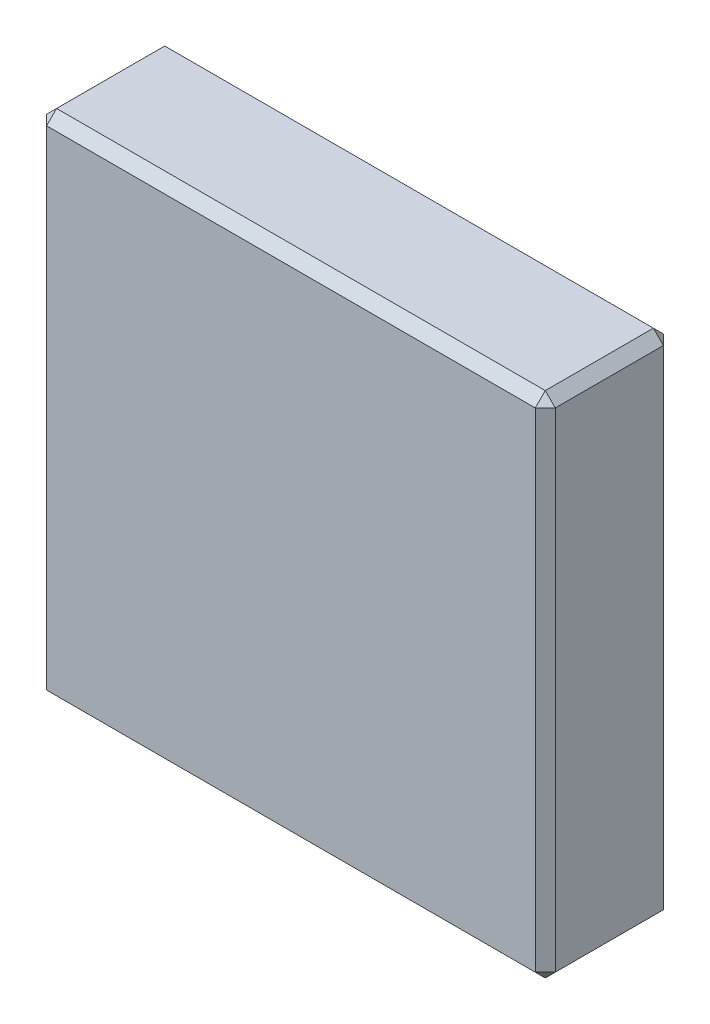
ISO-10303-21;
HEADER;
FILE_DESCRIPTION(('STEP AP214'),'2;1');
FILE_NAME('part.step','',(''),(''),'','','');
FILE_SCHEMA(('AUTOMOTIVE_DESIGN { 1 0 10303 214 1 1 1 1 }'));
ENDSEC;
DATA;
#1=APPLICATION_CONTEXT('core data for automotive mechanical design processes');
#2=APPLICATION_PROTOCOL_DEFINITION('international standard','automotive_design',2000,#1);
#3=PRODUCT_CONTEXT('',#1,'mechanical');
#4=PRODUCT('Part','Part','',(#3));
#5=PRODUCT_RELATED_PRODUCT_CATEGORY('part','',(#4));
#6=PRODUCT_DEFINITION_FORMATION('','',#4);
#7=PRODUCT_DEFINITION_CONTEXT('part definition',#1,'design');
#8=PRODUCT_DEFINITION('design','',#6,#7);
#9=PRODUCT_DEFINITION_SHAPE('','',#8);
#10=(LENGTH_UNIT() NAMED_UNIT(*) SI_UNIT(.MILLI.,.METRE.));
#11=(NAMED_UNIT(*) PLANE_ANGLE_UNIT() SI_UNIT($,.RADIAN.));
#12=(NAMED_UNIT(*) SI_UNIT($,.STERADIAN.) SOLID_ANGLE_UNIT());
#13=UNCERTAINTY_MEASURE_WITH_UNIT(LENGTH_MEASURE(1.E-05),#10,'distance_accuracy_value','');
#14=(GEOMETRIC_REPRESENTATION_CONTEXT(3) GLOBAL_UNCERTAINTY_ASSIGNED_CONTEXT((#13)) GLOBAL_UNIT_ASSIGNED_CONTEXT((#10,
#11,#12)) REPRESENTATION_CONTEXT('',''));
#15=CARTESIAN_POINT('',(0.,0.,0.));
#16=DIRECTION('',(0.,0.,1.));
#17=DIRECTION('',(1.,0.,0.));
#18=AXIS2_PLACEMENT_3D('',#15,#16,#17);
#19=CARTESIAN_POINT('',(-36.1080001619622,-4.88512596132532,16.3076773065464));
#20=DIRECTION('',(1.,0.,0.));
#21=DIRECTION('',(0.,0.,-1.));
#22=AXIS2_PLACEMENT_3D('',#19,#20,#21);
#23=PLANE('',#22);
#24=DIRECTION('',(0.,0.,-1.));
#25=VECTOR('',#24,1.);
#26=CARTESIAN_POINT('',(-36.1080001619622,7.56487403867468,16.3076773065464));
#27=LINE('',#26,#25);
#28=CARTESIAN_POINT('',(-36.1080001619622,7.56487403867468,16.0576773065464));
#29=VERTEX_POINT('',#28);
#30=CARTESIAN_POINT('',(-36.1080001619622,7.56487403867468,13.3576773065464));
#31=VERTEX_POINT('',#30);
#32=EDGE_CURVE('E113',#29,#31,#27,.T.);
#33=ORIENTED_EDGE('',*,*,#32,.T.);
#34=DIRECTION('',(0.,-1.,0.));
#35=VECTOR('',#34,1.);
#36=CARTESIAN_POINT('',(-36.1080001619622,-4.88512596132532,13.3576773065464));
#37=LINE('',#36,#35);
#38=CARTESIAN_POINT('',(-36.1080001619622,-4.63512596132532,13.3576773065464));
#39=VERTEX_POINT('',#38);
#40=EDGE_CURVE('E109',#31,#39,#37,.T.);
#41=ORIENTED_EDGE('',*,*,#40,.T.);
#42=DIRECTION('',(0.,0.,1.));
#43=VECTOR('',#42,1.);
#44=CARTESIAN_POINT('',(-36.1080001619622,-4.63512596132532,16.3076773065464));
#45=LINE('',#44,#43);
#46=CARTESIAN_POINT('',(-36.1080001619622,-4.63512596132532,16.0576773065464));
#47=VERTEX_POINT('',#46);
#48=EDGE_CURVE('E104',#39,#47,#45,.T.);
#49=ORIENTED_EDGE('',*,*,#48,.T.);
#50=DIRECTION('',(0.,1.,0.));
#51=VECTOR('',#50,1.);
#52=CARTESIAN_POINT('',(-36.1080001619622,-4.88512596132532,16.0576773065464));
#53=LINE('',#52,#51);
#54=EDGE_CURVE('E106',#47,#29,#53,.T.);
#55=ORIENTED_EDGE('',*,*,#54,.T.);
#56=EDGE_LOOP('',(#33,#41,#49,#55));
#57=FACE_BOUND('',#56,.T.);
#58=ADVANCED_FACE('F16',(#57),#23,.F.);
#59=CARTESIAN_POINT('',(-36.1080001619622,-4.88512596132532,16.3076773065464));
#60=DIRECTION('',(0.,1.,0.));
#61=DIRECTION('',(0.,0.,1.));
#62=AXIS2_PLACEMENT_3D('',#59,#60,#61);
#63=PLANE('',#62);
#64=DIRECTION('',(1.,0.,0.));
#65=VECTOR('',#64,1.);
#66=CARTESIAN_POINT('',(-23.4080001619622,-4.88512596132532,13.3576773065464));
#67=LINE('',#66,#65);
#68=CARTESIAN_POINT('',(-35.8580001619622,-4.88512596132532,13.3576773065464));
#69=VERTEX_POINT('',#68);
#70=CARTESIAN_POINT('',(-23.6580001619622,-4.88512596132532,13.3576773065464));
#71=VERTEX_POINT('',#70);
#72=EDGE_CURVE('E264',#69,#71,#67,.T.);
#73=ORIENTED_EDGE('',*,*,#72,.T.);
#74=DIRECTION('',(0.,0.,1.));
#75=VECTOR('',#74,1.);
#76=CARTESIAN_POINT('',(-23.6580001619622,-4.88512596132532,16.3076773065464));
#77=LINE('',#76,#75);
#78=CARTESIAN_POINT('',(-23.6580001619622,-4.88512596132532,16.0576773065464));
#79=VERTEX_POINT('',#78);
#80=EDGE_CURVE('E203',#71,#79,#77,.T.);
#81=ORIENTED_EDGE('',*,*,#80,.T.);
#82=DIRECTION('',(-1.,0.,0.));
#83=VECTOR('',#82,1.);
#84=CARTESIAN_POINT('',(-36.1080001619622,-4.88512596132532,16.0576773065464));
#85=LINE('',#84,#83);
#86=CARTESIAN_POINT('',(-35.8580001619622,-4.88512596132532,16.0576773065464));
#87=VERTEX_POINT('',#86);
#88=EDGE_CURVE('E261',#79,#87,#85,.T.);
#89=ORIENTED_EDGE('',*,*,#88,.T.);
#90=DIRECTION('',(0.,0.,-1.));
#91=VECTOR('',#90,1.);
#92=CARTESIAN_POINT('',(-35.8580001619622,-4.88512596132532,16.3076773065464));
#93=LINE('',#92,#91);
#94=EDGE_CURVE('E134',#87,#69,#93,.T.);
#95=ORIENTED_EDGE('',*,*,#94,.T.);
#96=EDGE_LOOP('',(#73,#81,#89,#95));
#97=FACE_BOUND('',#96,.T.);
#98=ADVANCED_FACE('F268',(#97),#63,.F.);
#99=CARTESIAN_POINT('',(-23.4080001619622,-4.88512596132532,16.3076773065464));
#100=DIRECTION('',(-1.,0.,0.));
#101=DIRECTION('',(0.,0.,1.));
#102=AXIS2_PLACEMENT_3D('',#99,#100,#101);
#103=PLANE('',#102);
#104=DIRECTION('',(0.,-1.,0.));
#105=VECTOR('',#104,1.);
#106=CARTESIAN_POINT('',(-23.4080001619622,-4.88512596132532,16.0576773065464));
#107=LINE('',#106,#105);
#108=CARTESIAN_POINT('',(-23.4080001619622,7.56487403867468,16.0576773065464));
#109=VERTEX_POINT('',#108);
#110=CARTESIAN_POINT('',(-23.4080001619622,-4.63512596132532,16.0576773065464));
#111=VERTEX_POINT('',#110);
#112=EDGE_CURVE('E249',#109,#111,#107,.T.);
#113=ORIENTED_EDGE('',*,*,#112,.T.);
#114=DIRECTION('',(0.,0.,-1.));
#115=VECTOR('',#114,1.);
#116=CARTESIAN_POINT('',(-23.4080001619622,-4.63512596132532,16.3076773065464));
#117=LINE('',#116,#115);
#118=CARTESIAN_POINT('',(-23.4080001619622,-4.63512596132532,13.3576773065464));
#119=VERTEX_POINT('',#118);
#120=EDGE_CURVE('E258',#111,#119,#117,.T.);
#121=ORIENTED_EDGE('',*,*,#120,.T.);
#122=DIRECTION('',(0.,1.,0.));
#123=VECTOR('',#122,1.);
#124=CARTESIAN_POINT('',(-23.4080001619622,7.81487403867468,13.3576773065464));
#125=LINE('',#124,#123);
#126=CARTESIAN_POINT('',(-23.4080001619622,7.56487403867468,13.3576773065464));
#127=VERTEX_POINT('',#126);
#128=EDGE_CURVE('E256',#119,#127,#125,.T.);
#129=ORIENTED_EDGE('',*,*,#128,.T.);
#130=DIRECTION('',(0.,0.,1.));
#131=VECTOR('',#130,1.);
#132=CARTESIAN_POINT('',(-23.4080001619622,7.56487403867468,16.3076773065464));
#133=LINE('',#132,#131);
#134=EDGE_CURVE('E193',#127,#109,#133,.T.);
#135=ORIENTED_EDGE('',*,*,#134,.T.);
#136=EDGE_LOOP('',(#113,#121,#129,#135));
#137=FACE_BOUND('',#136,.T.);
#138=ADVANCED_FACE('F289',(#137),#103,.F.);
#139=CARTESIAN_POINT('',(-36.1080001619622,7.81487403867468,16.3076773065464));
#140=DIRECTION('',(0.,-1.,0.));
#141=DIRECTION('',(0.,0.,-1.));
#142=AXIS2_PLACEMENT_3D('',#139,#140,#141);
#143=PLANE('',#142);
#144=DIRECTION('',(-1.,0.,0.));
#145=VECTOR('',#144,1.);
#146=CARTESIAN_POINT('',(-36.1080001619622,7.81487403867468,13.3576773065464));
#147=LINE('',#146,#145);
#148=CARTESIAN_POINT('',(-23.6580001619622,7.81487403867468,13.3576773065464));
#149=VERTEX_POINT('',#148);
#150=CARTESIAN_POINT('',(-35.8580001619622,7.81487403867468,13.3576773065464));
#151=VERTEX_POINT('',#150);
#152=EDGE_CURVE('E198',#149,#151,#147,.T.);
#153=ORIENTED_EDGE('',*,*,#152,.T.);
#154=DIRECTION('',(0.,0.,1.));
#155=VECTOR('',#154,1.);
#156=CARTESIAN_POINT('',(-35.8580001619622,7.81487403867468,16.3076773065464));
#157=LINE('',#156,#155);
#158=CARTESIAN_POINT('',(-35.8580001619622,7.81487403867468,16.0576773065464));
#159=VERTEX_POINT('',#158);
#160=EDGE_CURVE('E201',#151,#159,#157,.T.);
#161=ORIENTED_EDGE('',*,*,#160,.T.);
#162=DIRECTION('',(1.,0.,0.));
#163=VECTOR('',#162,1.);
#164=CARTESIAN_POINT('',(-36.1080001619622,7.81487403867468,16.0576773065464));
#165=LINE('',#164,#163);
#166=CARTESIAN_POINT('',(-23.6580001619622,7.81487403867468,16.0576773065464));
#167=VERTEX_POINT('',#166);
#168=EDGE_CURVE('E199',#159,#167,#165,.T.);
#169=ORIENTED_EDGE('',*,*,#168,.T.);
#170=DIRECTION('',(0.,0.,-1.));
#171=VECTOR('',#170,1.);
#172=CARTESIAN_POINT('',(-23.6580001619622,7.81487403867468,16.3076773065464));
#173=LINE('',#172,#171);
#174=EDGE_CURVE('E195',#167,#149,#173,.T.);
#175=ORIENTED_EDGE('',*,*,#174,.T.);
#176=EDGE_LOOP('',(#153,#161,#169,#175));
#177=FACE_BOUND('',#176,.T.);
#178=ADVANCED_FACE('F482',(#177),#143,.F.);
#179=CARTESIAN_POINT('',(-36.1080001619622,7.81487403867468,16.3076773065464));
#180=DIRECTION('',(0.,0.,-1.));
#181=DIRECTION('',(-1.,0.,0.));
#182=AXIS2_PLACEMENT_3D('',#179,#180,#181);
#183=PLANE('',#182);
#184=DIRECTION('',(1.,0.,0.));
#185=VECTOR('',#184,1.);
#186=CARTESIAN_POINT('',(-36.1080001619622,-4.63512596132532,16.3076773065464));
#187=LINE('',#186,#185);
#188=CARTESIAN_POINT('',(-35.8580001619622,-4.63512596132532,16.3076773065464));
#189=VERTEX_POINT('',#188);
#190=CARTESIAN_POINT('',(-23.6580001619622,-4.63512596132532,16.3076773065464));
#191=VERTEX_POINT('',#190);
#192=EDGE_CURVE('E25',#189,#191,#187,.T.);
#193=ORIENTED_EDGE('',*,*,#192,.T.);
#194=DIRECTION('',(0.,1.,0.));
#195=VECTOR('',#194,1.);
#196=CARTESIAN_POINT('',(-23.6580001619622,7.81487403867468,16.3076773065464));
#197=LINE('',#196,#195);
#198=CARTESIAN_POINT('',(-23.6580001619622,7.56487403867468,16.3076773065464));
#199=VERTEX_POINT('',#198);
#200=EDGE_CURVE('E11',#191,#199,#197,.T.);
#201=ORIENTED_EDGE('',*,*,#200,.T.);
#202=DIRECTION('',(-1.,0.,0.));
#203=VECTOR('',#202,1.);
#204=CARTESIAN_POINT('',(-36.1080001619622,7.56487403867468,16.3076773065464));
#205=LINE('',#204,#203);
#206=CARTESIAN_POINT('',(-35.8580001619622,7.56487403867468,16.3076773065464));
#207=VERTEX_POINT('',#206);
#208=EDGE_CURVE('E209',#199,#207,#205,.T.);
#209=ORIENTED_EDGE('',*,*,#208,.T.);
#210=DIRECTION('',(0.,-1.,0.));
#211=VECTOR('',#210,1.);
#212=CARTESIAN_POINT('',(-35.8580001619622,7.81487403867468,16.3076773065464));
#213=LINE('',#212,#211);
#214=EDGE_CURVE('E36',#207,#189,#213,.T.);
#215=ORIENTED_EDGE('',*,*,#214,.T.);
#216=EDGE_LOOP('',(#193,#201,#209,#215));
#217=FACE_BOUND('',#216,.T.);
#218=ADVANCED_FACE('F474',(#217),#183,.F.);
#219=CARTESIAN_POINT('',(-36.1080001619622,7.81487403867468,13.1076773065464));
#220=DIRECTION('',(0.,0.,-1.));
#221=DIRECTION('',(-1.,0.,0.));
#222=AXIS2_PLACEMENT_3D('',#219,#220,#221);
#223=PLANE('',#222);
#224=DIRECTION('',(-1.,0.,0.));
#225=VECTOR('',#224,1.);
#226=CARTESIAN_POINT('',(-36.1080001619622,-4.63512596132532,13.1076773065464));
#227=LINE('',#226,#225);
#228=CARTESIAN_POINT('',(-23.6580001619622,-4.63512596132532,13.1076773065464));
#229=VERTEX_POINT('',#228);
#230=CARTESIAN_POINT('',(-35.8580001619622,-4.63512596132532,13.1076773065464));
#231=VERTEX_POINT('',#230);
#232=EDGE_CURVE('E245',#229,#231,#227,.T.);
#233=ORIENTED_EDGE('',*,*,#232,.T.);
#234=DIRECTION('',(0.,1.,0.));
#235=VECTOR('',#234,1.);
#236=CARTESIAN_POINT('',(-35.8580001619622,7.81487403867468,13.1076773065464));
#237=LINE('',#236,#235);
#238=CARTESIAN_POINT('',(-35.8580001619622,7.56487403867468,13.1076773065464));
#239=VERTEX_POINT('',#238);
#240=EDGE_CURVE('E242',#231,#239,#237,.T.);
#241=ORIENTED_EDGE('',*,*,#240,.T.);
#242=DIRECTION('',(1.,0.,0.));
#243=VECTOR('',#242,1.);
#244=CARTESIAN_POINT('',(-23.4080001619622,7.56487403867468,13.1076773065464));
#245=LINE('',#244,#243);
#246=CARTESIAN_POINT('',(-23.6580001619622,7.56487403867468,13.1076773065464));
#247=VERTEX_POINT('',#246);
#248=EDGE_CURVE('E234',#239,#247,#245,.T.);
#249=ORIENTED_EDGE('',*,*,#248,.T.);
#250=DIRECTION('',(0.,-1.,0.));
#251=VECTOR('',#250,1.);
#252=CARTESIAN_POINT('',(-23.6580001619622,-4.88512596132532,13.1076773065464));
#253=LINE('',#252,#251);
#254=EDGE_CURVE('E239',#247,#229,#253,.T.);
#255=ORIENTED_EDGE('',*,*,#254,.T.);
#256=EDGE_LOOP('',(#233,#241,#249,#255));
#257=FACE_BOUND('',#256,.T.);
#258=ADVANCED_FACE('F243',(#257),#223,.T.);
#259=CARTESIAN_POINT('',(-23.6580001619622,7.81487403867468,16.3076773065464));
#260=DIRECTION('',(-0.707106781186547,0.,-0.707106781186547));
#261=DIRECTION('',(-0.707106781186548,0.,0.707106781186548));
#262=AXIS2_PLACEMENT_3D('',#259,#260,#261);
#263=PLANE('',#262);
#264=DIRECTION('',(-0.707106781186547,0.,0.707106781186547));
#265=VECTOR('',#264,1.);
#266=CARTESIAN_POINT('',(-23.4080001619622,7.56487403867468,16.0576773065464));
#267=LINE('',#266,#265);
#268=EDGE_CURVE('E20',#199,#109,#267,.F.);
#269=ORIENTED_EDGE('',*,*,#268,.F.);
#270=ORIENTED_EDGE('',*,*,#200,.F.);
#271=DIRECTION('',(0.707106781186547,0.,-0.707106781186547));
#272=VECTOR('',#271,1.);
#273=CARTESIAN_POINT('',(-23.5330001619622,-4.63512596132532,16.1826773065464));
#274=LINE('',#273,#272);
#275=EDGE_CURVE('E174',#111,#191,#274,.F.);
#276=ORIENTED_EDGE('',*,*,#275,.F.);
#277=ORIENTED_EDGE('',*,*,#112,.F.);
#278=EDGE_LOOP('',(#269,#270,#276,#277));
#279=FACE_BOUND('',#278,.T.);
#280=ADVANCED_FACE('F18',(#279),#263,.F.);
#281=CARTESIAN_POINT('',(-23.4080001619622,7.56487403867468,16.0576773065464));
#282=DIRECTION('',(0.577350269189626,0.577350269189626,0.577350269189626));
#283=DIRECTION('',(0.707106781186547,0.,-0.707106781186547));
#284=AXIS2_PLACEMENT_3D('',#281,#282,#283);
#285=PLANE('',#284);
#286=DIRECTION('',(0.,0.707106781186547,-0.707106781186547));
#287=VECTOR('',#286,1.);
#288=CARTESIAN_POINT('',(-23.6580001619622,7.68987403867468,16.1826773065464));
#289=LINE('',#288,#287);
#290=EDGE_CURVE('E169',#199,#167,#289,.T.);
#291=ORIENTED_EDGE('',*,*,#290,.F.);
#292=ORIENTED_EDGE('',*,*,#268,.T.);
#293=DIRECTION('',(0.707106781186547,-0.707106781186547,0.));
#294=VECTOR('',#293,1.);
#295=CARTESIAN_POINT('',(-23.4080001619622,7.56487403867468,16.0576773065464));
#296=LINE('',#295,#294);
#297=EDGE_CURVE('E172',#167,#109,#296,.T.);
#298=ORIENTED_EDGE('',*,*,#297,.F.);
#299=EDGE_LOOP('',(#291,#292,#298));
#300=FACE_BOUND('',#299,.T.);
#301=ADVANCED_FACE('F185',(#300),#285,.T.);
#302=CARTESIAN_POINT('',(-23.6580001619622,-4.88512596132532,16.0576773065464));
#303=DIRECTION('',(0.577350269189626,-0.577350269189626,0.577350269189626));
#304=DIRECTION('',(0.707106781186547,0.,-0.707106781186547));
#305=AXIS2_PLACEMENT_3D('',#302,#303,#304);
#306=PLANE('',#305);
#307=DIRECTION('',(-0.707106781186547,-0.707106781186547,0.));
#308=VECTOR('',#307,1.);
#309=CARTESIAN_POINT('',(-23.6580001619622,-4.88512596132532,16.0576773065464));
#310=LINE('',#309,#308);
#311=EDGE_CURVE('E163',#111,#79,#310,.T.);
#312=ORIENTED_EDGE('',*,*,#311,.F.);
#313=ORIENTED_EDGE('',*,*,#275,.T.);
#314=DIRECTION('',(0.,0.707106781186547,0.707106781186547));
#315=VECTOR('',#314,1.);
#316=CARTESIAN_POINT('',(-23.6580001619622,-4.88512596132532,16.0576773065464));
#317=LINE('',#316,#315);
#318=EDGE_CURVE('E166',#79,#191,#317,.T.);
#319=ORIENTED_EDGE('',*,*,#318,.F.);
#320=EDGE_LOOP('',(#312,#313,#319));
#321=FACE_BOUND('',#320,.T.);
#322=ADVANCED_FACE('F290',(#321),#306,.T.);
#323=CARTESIAN_POINT('',(-23.6580001619622,7.81487403867468,16.3076773065464));
#324=DIRECTION('',(-0.707106781186547,-0.707106781186547,0.));
#325=DIRECTION('',(0.707106781186548,-0.707106781186548,0.));
#326=AXIS2_PLACEMENT_3D('',#323,#324,#325);
#327=PLANE('',#326);
#328=ORIENTED_EDGE('',*,*,#297,.T.);
#329=ORIENTED_EDGE('',*,*,#134,.F.);
#330=DIRECTION('',(-0.707106781186547,0.707106781186547,0.));
#331=VECTOR('',#330,1.);
#332=CARTESIAN_POINT('',(-23.4080001619622,7.56487403867468,13.3576773065464));
#333=LINE('',#332,#331);
#334=EDGE_CURVE('E157',#149,#127,#333,.F.);
#335=ORIENTED_EDGE('',*,*,#334,.F.);
#336=ORIENTED_EDGE('',*,*,#174,.F.);
#337=EDGE_LOOP('',(#328,#329,#335,#336));
#338=FACE_BOUND('',#337,.T.);
#339=ADVANCED_FACE('F191',(#338),#327,.F.);
#340=CARTESIAN_POINT('',(-36.1080001619622,7.56487403867468,16.3076773065464));
#341=DIRECTION('',(0.,-0.707106781186547,-0.707106781186547));
#342=DIRECTION('',(0.,0.707106781186548,-0.707106781186548));
#343=AXIS2_PLACEMENT_3D('',#340,#341,#342);
#344=PLANE('',#343);
#345=ORIENTED_EDGE('',*,*,#290,.T.);
#346=ORIENTED_EDGE('',*,*,#168,.F.);
#347=DIRECTION('',(0.,-0.707106781186547,0.707106781186547));
#348=VECTOR('',#347,1.);
#349=CARTESIAN_POINT('',(-35.8580001619622,7.81487403867468,16.0576773065464));
#350=LINE('',#349,#348);
#351=EDGE_CURVE('E154',#207,#159,#350,.F.);
#352=ORIENTED_EDGE('',*,*,#351,.F.);
#353=ORIENTED_EDGE('',*,*,#208,.F.);
#354=EDGE_LOOP('',(#345,#346,#352,#353));
#355=FACE_BOUND('',#354,.T.);
#356=ADVANCED_FACE('F301',(#355),#344,.F.);
#357=CARTESIAN_POINT('',(-35.8580001619622,7.81487403867468,16.3076773065464));
#358=DIRECTION('',(0.707106781186547,0.,-0.707106781186547));
#359=DIRECTION('',(-0.707106781186548,0.,-0.707106781186548));
#360=AXIS2_PLACEMENT_3D('',#357,#358,#359);
#361=PLANE('',#360);
#362=DIRECTION('',(0.707106781186547,0.,0.707106781186547));
#363=VECTOR('',#362,1.);
#364=CARTESIAN_POINT('',(-36.1080001619622,-4.63512596132532,16.0576773065464));
#365=LINE('',#364,#363);
#366=EDGE_CURVE('E119',#189,#47,#365,.F.);
#367=ORIENTED_EDGE('',*,*,#366,.F.);
#368=ORIENTED_EDGE('',*,*,#214,.F.);
#369=DIRECTION('',(-0.707106781186547,0.,-0.707106781186547));
#370=VECTOR('',#369,1.);
#371=CARTESIAN_POINT('',(-35.9830001619622,7.56487403867468,16.1826773065464));
#372=LINE('',#371,#370);
#373=EDGE_CURVE('E122',#29,#207,#372,.F.);
#374=ORIENTED_EDGE('',*,*,#373,.F.);
#375=ORIENTED_EDGE('',*,*,#54,.F.);
#376=EDGE_LOOP('',(#367,#368,#374,#375));
#377=FACE_BOUND('',#376,.T.);
#378=ADVANCED_FACE('F118',(#377),#361,.F.);
#379=CARTESIAN_POINT('',(-36.1080001619622,-4.63512596132532,16.3076773065464));
#380=DIRECTION('',(0.,0.707106781186547,-0.707106781186547));
#381=DIRECTION('',(0.,0.707106781186548,0.707106781186548));
#382=AXIS2_PLACEMENT_3D('',#379,#380,#381);
#383=PLANE('',#382);
#384=ORIENTED_EDGE('',*,*,#318,.T.);
#385=ORIENTED_EDGE('',*,*,#192,.F.);
#386=DIRECTION('',(0.,-0.707106781186547,-0.707106781186547));
#387=VECTOR('',#386,1.);
#388=CARTESIAN_POINT('',(-35.8580001619622,-4.76012596132532,16.1826773065464));
#389=LINE('',#388,#387);
#390=EDGE_CURVE('E131',#87,#189,#389,.F.);
#391=ORIENTED_EDGE('',*,*,#390,.F.);
#392=ORIENTED_EDGE('',*,*,#88,.F.);
#393=EDGE_LOOP('',(#384,#385,#391,#392));
#394=FACE_BOUND('',#393,.T.);
#395=ADVANCED_FACE('F292',(#394),#383,.F.);
#396=CARTESIAN_POINT('',(-23.4080001619622,-4.63512596132532,16.3076773065464));
#397=DIRECTION('',(-0.707106781186547,0.707106781186547,0.));
#398=DIRECTION('',(-0.707106781186548,-0.707106781186548,0.));
#399=AXIS2_PLACEMENT_3D('',#396,#397,#398);
#400=PLANE('',#399);
#401=ORIENTED_EDGE('',*,*,#311,.T.);
#402=ORIENTED_EDGE('',*,*,#80,.F.);
#403=DIRECTION('',(0.707106781186547,0.707106781186547,0.));
#404=VECTOR('',#403,1.);
#405=CARTESIAN_POINT('',(-23.4080001619622,-4.63512596132532,13.3576773065464));
#406=LINE('',#405,#404);
#407=EDGE_CURVE('E149',#119,#71,#406,.F.);
#408=ORIENTED_EDGE('',*,*,#407,.F.);
#409=ORIENTED_EDGE('',*,*,#120,.F.);
#410=EDGE_LOOP('',(#401,#402,#408,#409));
#411=FACE_BOUND('',#410,.T.);
#412=ADVANCED_FACE('F272',(#411),#400,.F.);
#413=CARTESIAN_POINT('',(-23.4080001619622,-4.88512596132532,13.3576773065464));
#414=DIRECTION('',(0.707106781186547,0.,-0.707106781186547));
#415=DIRECTION('',(-0.707106781186548,0.,-0.707106781186548));
#416=AXIS2_PLACEMENT_3D('',#413,#414,#415);
#417=PLANE('',#416);
#418=DIRECTION('',(-0.707106781186547,0.,-0.707106781186547));
#419=VECTOR('',#418,1.);
#420=CARTESIAN_POINT('',(-23.4080001619622,7.56487403867468,13.3576773065464));
#421=LINE('',#420,#419);
#422=EDGE_CURVE('E160',#127,#247,#421,.T.);
#423=ORIENTED_EDGE('',*,*,#422,.F.);
#424=ORIENTED_EDGE('',*,*,#128,.F.);
#425=DIRECTION('',(0.707106781186547,0.,0.707106781186547));
#426=VECTOR('',#425,1.);
#427=CARTESIAN_POINT('',(-23.4080001619622,-4.63512596132532,13.3576773065464));
#428=LINE('',#427,#426);
#429=EDGE_CURVE('E147',#229,#119,#428,.T.);
#430=ORIENTED_EDGE('',*,*,#429,.F.);
#431=ORIENTED_EDGE('',*,*,#254,.F.);
#432=EDGE_LOOP('',(#423,#424,#430,#431));
#433=FACE_BOUND('',#432,.T.);
#434=ADVANCED_FACE('F287',(#433),#417,.T.);
#435=CARTESIAN_POINT('',(-23.4080001619622,7.56487403867468,13.3576773065464));
#436=DIRECTION('',(0.577350269189626,0.577350269189626,-0.577350269189626));
#437=DIRECTION('',(-0.707106781186547,0.,-0.707106781186547));
#438=AXIS2_PLACEMENT_3D('',#435,#436,#437);
#439=PLANE('',#438);
#440=ORIENTED_EDGE('',*,*,#334,.T.);
#441=ORIENTED_EDGE('',*,*,#422,.T.);
#442=DIRECTION('',(0.,0.707106781186547,0.707106781186547));
#443=VECTOR('',#442,1.);
#444=CARTESIAN_POINT('',(-23.6580001619622,7.68987403867468,13.2326773065464));
#445=LINE('',#444,#443);
#446=EDGE_CURVE('E138',#149,#247,#445,.F.);
#447=ORIENTED_EDGE('',*,*,#446,.F.);
#448=EDGE_LOOP('',(#440,#441,#447));
#449=FACE_BOUND('',#448,.T.);
#450=ADVANCED_FACE('F334',(#449),#439,.T.);
#451=CARTESIAN_POINT('',(-35.8580001619622,7.81487403867468,16.0576773065464));
#452=DIRECTION('',(-0.577350269189626,0.577350269189626,0.577350269189626));
#453=DIRECTION('',(0.707106781186547,0.,0.707106781186547));
#454=AXIS2_PLACEMENT_3D('',#451,#452,#453);
#455=PLANE('',#454);
#456=ORIENTED_EDGE('',*,*,#373,.T.);
#457=ORIENTED_EDGE('',*,*,#351,.T.);
#458=DIRECTION('',(0.707106781186547,0.707106781186547,0.));
#459=VECTOR('',#458,1.);
#460=CARTESIAN_POINT('',(-35.8580001619622,7.81487403867468,16.0576773065464));
#461=LINE('',#460,#459);
#462=EDGE_CURVE('E135',#29,#159,#461,.T.);
#463=ORIENTED_EDGE('',*,*,#462,.F.);
#464=EDGE_LOOP('',(#456,#457,#463));
#465=FACE_BOUND('',#464,.T.);
#466=ADVANCED_FACE('F331',(#465),#455,.T.);
#467=CARTESIAN_POINT('',(-36.1080001619622,-4.63512596132532,16.0576773065464));
#468=DIRECTION('',(-0.577350269189626,-0.577350269189626,0.577350269189626));
#469=DIRECTION('',(0.707106781186547,0.,0.707106781186547));
#470=AXIS2_PLACEMENT_3D('',#467,#468,#469);
#471=PLANE('',#470);
#472=ORIENTED_EDGE('',*,*,#390,.T.);
#473=ORIENTED_EDGE('',*,*,#366,.T.);
#474=DIRECTION('',(-0.707106781186547,0.707106781186547,0.));
#475=VECTOR('',#474,1.);
#476=CARTESIAN_POINT('',(-36.1080001619622,-4.63512596132532,16.0576773065464));
#477=LINE('',#476,#475);
#478=EDGE_CURVE('E128',#87,#47,#477,.T.);
#479=ORIENTED_EDGE('',*,*,#478,.F.);
#480=EDGE_LOOP('',(#472,#473,#479));
#481=FACE_BOUND('',#480,.T.);
#482=ADVANCED_FACE('F127',(#481),#471,.T.);
#483=CARTESIAN_POINT('',(-23.4080001619622,-4.63512596132532,13.3576773065464));
#484=DIRECTION('',(0.577350269189626,-0.577350269189626,-0.577350269189626));
#485=DIRECTION('',(-0.707106781186547,0.,-0.707106781186547));
#486=AXIS2_PLACEMENT_3D('',#483,#484,#485);
#487=PLANE('',#486);
#488=ORIENTED_EDGE('',*,*,#429,.T.);
#489=ORIENTED_EDGE('',*,*,#407,.T.);
#490=DIRECTION('',(0.,0.707106781186547,-0.707106781186547));
#491=VECTOR('',#490,1.);
#492=CARTESIAN_POINT('',(-23.6580001619622,-4.76012596132532,13.2326773065464));
#493=LINE('',#492,#491);
#494=EDGE_CURVE('E136',#229,#71,#493,.F.);
#495=ORIENTED_EDGE('',*,*,#494,.F.);
#496=EDGE_LOOP('',(#488,#489,#495));
#497=FACE_BOUND('',#496,.T.);
#498=ADVANCED_FACE('F277',(#497),#487,.T.);
#499=CARTESIAN_POINT('',(-36.1080001619622,7.81487403867468,13.3576773065464));
#500=DIRECTION('',(0.,0.707106781186547,-0.707106781186547));
#501=DIRECTION('',(0.,0.707106781186548,0.707106781186548));
#502=AXIS2_PLACEMENT_3D('',#499,#500,#501);
#503=PLANE('',#502);
#504=ORIENTED_EDGE('',*,*,#446,.T.);
#505=ORIENTED_EDGE('',*,*,#248,.F.);
#506=DIRECTION('',(0.,-0.707106781186547,-0.707106781186547));
#507=VECTOR('',#506,1.);
#508=CARTESIAN_POINT('',(-35.8580001619622,7.56487403867468,13.1076773065464));
#509=LINE('',#508,#507);
#510=EDGE_CURVE('E141',#151,#239,#509,.T.);
#511=ORIENTED_EDGE('',*,*,#510,.F.);
#512=ORIENTED_EDGE('',*,*,#152,.F.);
#513=EDGE_LOOP('',(#504,#505,#511,#512));
#514=FACE_BOUND('',#513,.T.);
#515=ADVANCED_FACE('F236',(#514),#503,.T.);
#516=CARTESIAN_POINT('',(-36.1080001619622,7.56487403867468,16.3076773065464));
#517=DIRECTION('',(0.707106781186547,-0.707106781186547,0.));
#518=DIRECTION('',(0.707106781186548,0.707106781186548,0.));
#519=AXIS2_PLACEMENT_3D('',#516,#517,#518);
#520=PLANE('',#519);
#521=ORIENTED_EDGE('',*,*,#462,.T.);
#522=ORIENTED_EDGE('',*,*,#160,.F.);
#523=DIRECTION('',(-0.707106781186547,-0.707106781186547,0.));
#524=VECTOR('',#523,1.);
#525=CARTESIAN_POINT('',(-35.9830001619622,7.68987403867468,13.3576773065464));
#526=LINE('',#525,#524);
#527=EDGE_CURVE('E223',#31,#151,#526,.F.);
#528=ORIENTED_EDGE('',*,*,#527,.F.);
#529=ORIENTED_EDGE('',*,*,#32,.F.);
#530=EDGE_LOOP('',(#521,#522,#528,#529));
#531=FACE_BOUND('',#530,.T.);
#532=ADVANCED_FACE('F321',(#531),#520,.F.);
#533=CARTESIAN_POINT('',(-35.8580001619622,-4.88512596132532,16.3076773065464));
#534=DIRECTION('',(0.707106781186547,0.707106781186547,0.));
#535=DIRECTION('',(-0.707106781186548,0.707106781186548,0.));
#536=AXIS2_PLACEMENT_3D('',#533,#534,#535);
#537=PLANE('',#536);
#538=ORIENTED_EDGE('',*,*,#478,.T.);
#539=ORIENTED_EDGE('',*,*,#48,.F.);
#540=DIRECTION('',(0.707106781186547,-0.707106781186547,0.));
#541=VECTOR('',#540,1.);
#542=CARTESIAN_POINT('',(-36.1080001619622,-4.63512596132532,13.3576773065464));
#543=LINE('',#542,#541);
#544=EDGE_CURVE('E220',#69,#39,#543,.F.);
#545=ORIENTED_EDGE('',*,*,#544,.F.);
#546=ORIENTED_EDGE('',*,*,#94,.F.);
#547=EDGE_LOOP('',(#538,#539,#545,#546));
#548=FACE_BOUND('',#547,.T.);
#549=ADVANCED_FACE('F133',(#548),#537,.F.);
#550=CARTESIAN_POINT('',(-36.1080001619622,-4.88512596132532,13.3576773065464));
#551=DIRECTION('',(0.,-0.707106781186547,-0.707106781186547));
#552=DIRECTION('',(0.,0.707106781186548,-0.707106781186548));
#553=AXIS2_PLACEMENT_3D('',#550,#551,#552);
#554=PLANE('',#553);
#555=ORIENTED_EDGE('',*,*,#494,.T.);
#556=ORIENTED_EDGE('',*,*,#72,.F.);
#557=DIRECTION('',(0.,-0.707106781186547,0.707106781186547));
#558=VECTOR('',#557,1.);
#559=CARTESIAN_POINT('',(-35.8580001619622,-4.76012596132532,13.2326773065464));
#560=LINE('',#559,#558);
#561=EDGE_CURVE('E217',#231,#69,#560,.T.);
#562=ORIENTED_EDGE('',*,*,#561,.F.);
#563=ORIENTED_EDGE('',*,*,#232,.F.);
#564=EDGE_LOOP('',(#555,#556,#562,#563));
#565=FACE_BOUND('',#564,.T.);
#566=ADVANCED_FACE('F280',(#565),#554,.T.);
#567=CARTESIAN_POINT('',(-35.8580001619622,7.56487403867468,13.1076773065464));
#568=DIRECTION('',(-0.577350269189626,0.577350269189626,-0.577350269189626));
#569=DIRECTION('',(-0.707106781186547,0.,0.707106781186547));
#570=AXIS2_PLACEMENT_3D('',#567,#568,#569);
#571=PLANE('',#570);
#572=ORIENTED_EDGE('',*,*,#527,.T.);
#573=ORIENTED_EDGE('',*,*,#510,.T.);
#574=DIRECTION('',(-0.707106781186547,0.,0.707106781186547));
#575=VECTOR('',#574,1.);
#576=CARTESIAN_POINT('',(-35.8580001619622,7.56487403867468,13.1076773065464));
#577=LINE('',#576,#575);
#578=EDGE_CURVE('E215',#31,#239,#577,.F.);
#579=ORIENTED_EDGE('',*,*,#578,.F.);
#580=EDGE_LOOP('',(#572,#573,#579));
#581=FACE_BOUND('',#580,.T.);
#582=ADVANCED_FACE('F230',(#581),#571,.T.);
#583=CARTESIAN_POINT('',(-36.1080001619622,-4.63512596132532,13.3576773065464));
#584=DIRECTION('',(-0.577350269189626,-0.577350269189626,-0.577350269189626));
#585=DIRECTION('',(-0.707106781186547,0.,0.707106781186547));
#586=AXIS2_PLACEMENT_3D('',#583,#584,#585);
#587=PLANE('',#586);
#588=ORIENTED_EDGE('',*,*,#561,.T.);
#589=ORIENTED_EDGE('',*,*,#544,.T.);
#590=DIRECTION('',(0.707106781186547,0.,-0.707106781186547));
#591=VECTOR('',#590,1.);
#592=CARTESIAN_POINT('',(-36.1080001619622,-4.63512596132532,13.3576773065464));
#593=LINE('',#592,#591);
#594=EDGE_CURVE('E213',#231,#39,#593,.F.);
#595=ORIENTED_EDGE('',*,*,#594,.F.);
#596=EDGE_LOOP('',(#588,#589,#595));
#597=FACE_BOUND('',#596,.T.);
#598=ADVANCED_FACE('F282',(#597),#587,.T.);
#599=CARTESIAN_POINT('',(-36.1080001619622,-4.88512596132532,13.3576773065464));
#600=DIRECTION('',(-0.707106781186547,0.,-0.707106781186547));
#601=DIRECTION('',(-0.707106781186548,0.,0.707106781186548));
#602=AXIS2_PLACEMENT_3D('',#599,#600,#601);
#603=PLANE('',#602);
#604=ORIENTED_EDGE('',*,*,#578,.T.);
#605=ORIENTED_EDGE('',*,*,#240,.F.);
#606=ORIENTED_EDGE('',*,*,#594,.T.);
#607=ORIENTED_EDGE('',*,*,#40,.F.);
#608=EDGE_LOOP('',(#604,#605,#606,#607));
#609=FACE_BOUND('',#608,.T.);
#610=ADVANCED_FACE('F283',(#609),#603,.T.);
#611=CLOSED_SHELL('',(#58,#98,#138,#178,#218,#258,#280,#301,#322,#339,#356,#378,#395,#412,#434,
#450,#466,#482,#498,#515,#532,#549,#566,#582,#598,#610));
#612=MANIFOLD_SOLID_BREP('B1',#611);
#613=ADVANCED_BREP_SHAPE_REPRESENTATION('',(#18,#612),#14);
#614=SHAPE_DEFINITION_REPRESENTATION(#9,#613);
ENDSEC;
END-ISO-10303-21;
